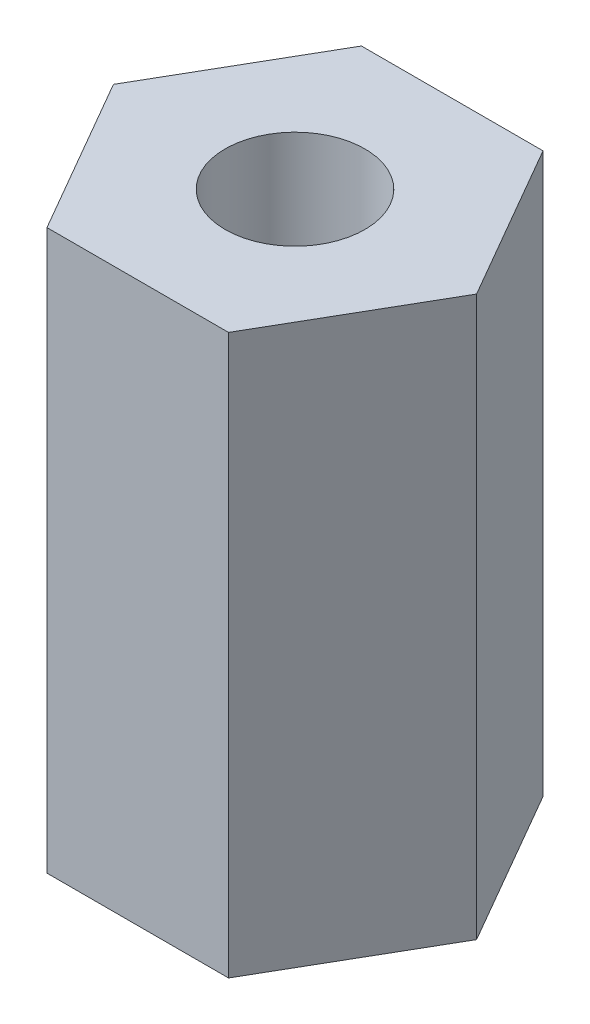
ISO-10303-21;
HEADER;
FILE_DESCRIPTION(('STEP AP214'),'2;1');
FILE_NAME('part.step','',(''),(''),'','','');
FILE_SCHEMA(('AUTOMOTIVE_DESIGN { 1 0 10303 214 1 1 1 1 }'));
ENDSEC;
DATA;
#1=APPLICATION_CONTEXT('core data for automotive mechanical design processes');
#2=APPLICATION_PROTOCOL_DEFINITION('international standard','automotive_design',2000,#1);
#3=PRODUCT_CONTEXT('',#1,'mechanical');
#4=PRODUCT('Part','Part','',(#3));
#5=PRODUCT_RELATED_PRODUCT_CATEGORY('part','',(#4));
#6=PRODUCT_DEFINITION_FORMATION('','',#4);
#7=PRODUCT_DEFINITION_CONTEXT('part definition',#1,'design');
#8=PRODUCT_DEFINITION('design','',#6,#7);
#9=PRODUCT_DEFINITION_SHAPE('','',#8);
#10=(LENGTH_UNIT() NAMED_UNIT(*) SI_UNIT(.MILLI.,.METRE.));
#11=(NAMED_UNIT(*) PLANE_ANGLE_UNIT() SI_UNIT($,.RADIAN.));
#12=(NAMED_UNIT(*) SI_UNIT($,.STERADIAN.) SOLID_ANGLE_UNIT());
#13=UNCERTAINTY_MEASURE_WITH_UNIT(LENGTH_MEASURE(1.E-05),#10,'distance_accuracy_value','');
#14=(GEOMETRIC_REPRESENTATION_CONTEXT(3) GLOBAL_UNCERTAINTY_ASSIGNED_CONTEXT((#13)) GLOBAL_UNIT_ASSIGNED_CONTEXT((#10,
#11,#12)) REPRESENTATION_CONTEXT('',''));
#15=CARTESIAN_POINT('',(0.,0.,0.));
#16=DIRECTION('',(0.,0.,1.));
#17=DIRECTION('',(1.,0.,0.));
#18=AXIS2_PLACEMENT_3D('',#15,#16,#17);
#19=CARTESIAN_POINT('',(0.,5.08,0.));
#20=DIRECTION('',(0.,1.,0.));
#21=DIRECTION('',(0.,0.,1.));
#22=AXIS2_PLACEMENT_3D('',#19,#20,#21);
#23=PLANE('',#22);
#24=DIRECTION('',(1.,0.,0.));
#25=VECTOR('',#24,1.);
#26=CARTESIAN_POINT('',(-1.64977839420936,5.08,2.8575));
#27=LINE('',#26,#25);
#28=CARTESIAN_POINT('',(-1.64977839420936,5.08,2.8575));
#29=VERTEX_POINT('',#28);
#30=CARTESIAN_POINT('',(1.64977839420935,5.08,2.8575));
#31=VERTEX_POINT('',#30);
#32=EDGE_CURVE('E130',#29,#31,#27,.T.);
#33=ORIENTED_EDGE('',*,*,#32,.T.);
#34=DIRECTION('',(0.5,0.,-0.866025403784439));
#35=VECTOR('',#34,1.);
#36=CARTESIAN_POINT('',(1.64977839420935,5.08,2.8575));
#37=LINE('',#36,#35);
#38=CARTESIAN_POINT('',(3.29955678841871,5.08,0.));
#39=VERTEX_POINT('',#38);
#40=EDGE_CURVE('E88',#31,#39,#37,.T.);
#41=ORIENTED_EDGE('',*,*,#40,.T.);
#42=DIRECTION('',(-0.5,0.,-0.866025403784438));
#43=VECTOR('',#42,1.);
#44=CARTESIAN_POINT('',(3.29955678841871,5.08,0.));
#45=LINE('',#44,#43);
#46=CARTESIAN_POINT('',(1.64977839420935,5.08,-2.8575));
#47=VERTEX_POINT('',#46);
#48=EDGE_CURVE('E101',#39,#47,#45,.T.);
#49=ORIENTED_EDGE('',*,*,#48,.T.);
#50=DIRECTION('',(-1.,0.,0.));
#51=VECTOR('',#50,1.);
#52=CARTESIAN_POINT('',(1.64977839420935,5.08,-2.8575));
#53=LINE('',#52,#51);
#54=CARTESIAN_POINT('',(-1.64977839420936,5.08,-2.8575));
#55=VERTEX_POINT('',#54);
#56=EDGE_CURVE('E95',#47,#55,#53,.T.);
#57=ORIENTED_EDGE('',*,*,#56,.T.);
#58=DIRECTION('',(-0.5,0.,0.866025403784438));
#59=VECTOR('',#58,1.);
#60=CARTESIAN_POINT('',(-1.64977839420936,5.08,-2.8575));
#61=LINE('',#60,#59);
#62=CARTESIAN_POINT('',(-3.29955678841871,5.08,0.));
#63=VERTEX_POINT('',#62);
#64=EDGE_CURVE('E99',#55,#63,#61,.T.);
#65=ORIENTED_EDGE('',*,*,#64,.T.);
#66=DIRECTION('',(0.5,0.,0.866025403784438));
#67=VECTOR('',#66,1.);
#68=CARTESIAN_POINT('',(-3.29955678841871,5.08,0.));
#69=LINE('',#68,#67);
#70=EDGE_CURVE('E51',#63,#29,#69,.T.);
#71=ORIENTED_EDGE('',*,*,#70,.T.);
#72=EDGE_LOOP('',(#33,#41,#49,#57,#65,#71));
#73=FACE_BOUND('',#72,.T.);
#74=CARTESIAN_POINT('',(0.,5.08,0.));
#75=DIRECTION('',(0.,1.,0.));
#76=DIRECTION('',(0.,0.,1.));
#77=AXIS2_PLACEMENT_3D('',#74,#75,#76);
#78=CIRCLE('',#77,1.27);
#79=CARTESIAN_POINT('',(0.,5.08,1.27));
#80=VERTEX_POINT('',#79);
#81=EDGE_CURVE('E123',#80,#80,#78,.T.);
#82=ORIENTED_EDGE('',*,*,#81,.F.);
#83=EDGE_LOOP('',(#82));
#84=FACE_BOUND('',#83,.T.);
#85=ADVANCED_FACE('F34',(#73,#84),#23,.T.);
#86=CARTESIAN_POINT('',(0.,-5.08,0.));
#87=DIRECTION('',(0.,1.,0.));
#88=DIRECTION('',(0.,0.,1.));
#89=AXIS2_PLACEMENT_3D('',#86,#87,#88);
#90=PLANE('',#89);
#91=DIRECTION('',(1.,0.,0.));
#92=VECTOR('',#91,1.);
#93=CARTESIAN_POINT('',(-1.64977839420936,-5.08,2.8575));
#94=LINE('',#93,#92);
#95=CARTESIAN_POINT('',(-1.64977839420936,-5.08,2.8575));
#96=VERTEX_POINT('',#95);
#97=CARTESIAN_POINT('',(1.64977839420935,-5.08,2.8575));
#98=VERTEX_POINT('',#97);
#99=EDGE_CURVE('E119',#96,#98,#94,.T.);
#100=ORIENTED_EDGE('',*,*,#99,.F.);
#101=DIRECTION('',(0.5,0.,0.866025403784438));
#102=VECTOR('',#101,1.);
#103=CARTESIAN_POINT('',(-3.29955678841871,-5.08,0.));
#104=LINE('',#103,#102);
#105=CARTESIAN_POINT('',(-3.29955678841871,-5.08,0.));
#106=VERTEX_POINT('',#105);
#107=EDGE_CURVE('E80',#106,#96,#104,.T.);
#108=ORIENTED_EDGE('',*,*,#107,.F.);
#109=DIRECTION('',(-0.5,0.,0.866025403784438));
#110=VECTOR('',#109,1.);
#111=CARTESIAN_POINT('',(-1.64977839420936,-5.08,-2.8575));
#112=LINE('',#111,#110);
#113=CARTESIAN_POINT('',(-1.64977839420936,-5.08,-2.8575));
#114=VERTEX_POINT('',#113);
#115=EDGE_CURVE('E74',#114,#106,#112,.T.);
#116=ORIENTED_EDGE('',*,*,#115,.F.);
#117=DIRECTION('',(-1.,0.,0.));
#118=VECTOR('',#117,1.);
#119=CARTESIAN_POINT('',(1.64977839420935,-5.08,-2.8575));
#120=LINE('',#119,#118);
#121=CARTESIAN_POINT('',(1.64977839420935,-5.08,-2.8575));
#122=VERTEX_POINT('',#121);
#123=EDGE_CURVE('E109',#122,#114,#120,.T.);
#124=ORIENTED_EDGE('',*,*,#123,.F.);
#125=DIRECTION('',(-0.5,0.,-0.866025403784438));
#126=VECTOR('',#125,1.);
#127=CARTESIAN_POINT('',(3.29955678841871,-5.08,0.));
#128=LINE('',#127,#126);
#129=CARTESIAN_POINT('',(3.29955678841871,-5.08,0.));
#130=VERTEX_POINT('',#129);
#131=EDGE_CURVE('E125',#130,#122,#128,.T.);
#132=ORIENTED_EDGE('',*,*,#131,.F.);
#133=DIRECTION('',(0.5,0.,-0.866025403784439));
#134=VECTOR('',#133,1.);
#135=CARTESIAN_POINT('',(1.64977839420935,-5.08,2.8575));
#136=LINE('',#135,#134);
#137=EDGE_CURVE('E122',#98,#130,#136,.T.);
#138=ORIENTED_EDGE('',*,*,#137,.F.);
#139=EDGE_LOOP('',(#100,#108,#116,#124,#132,#138));
#140=FACE_BOUND('',#139,.T.);
#141=CARTESIAN_POINT('',(0.,-5.08,0.));
#142=DIRECTION('',(0.,1.,0.));
#143=DIRECTION('',(0.,0.,1.));
#144=AXIS2_PLACEMENT_3D('',#141,#142,#143);
#145=CIRCLE('',#144,1.27);
#146=CARTESIAN_POINT('',(0.,-5.08,1.27));
#147=VERTEX_POINT('',#146);
#148=EDGE_CURVE('E223',#147,#147,#145,.T.);
#149=ORIENTED_EDGE('',*,*,#148,.T.);
#150=EDGE_LOOP('',(#149));
#151=FACE_BOUND('',#150,.T.);
#152=ADVANCED_FACE('F139',(#140,#151),#90,.F.);
#153=CARTESIAN_POINT('',(-1.64977839420936,5.08,2.8575));
#154=DIRECTION('',(0.,0.,-1.));
#155=DIRECTION('',(-1.,0.,0.));
#156=AXIS2_PLACEMENT_3D('',#153,#154,#155);
#157=PLANE('',#156);
#158=ORIENTED_EDGE('',*,*,#99,.T.);
#159=DIRECTION('',(0.,-1.,0.));
#160=VECTOR('',#159,1.);
#161=CARTESIAN_POINT('',(1.64977839420935,5.08,2.8575));
#162=LINE('',#161,#160);
#163=EDGE_CURVE('E11',#31,#98,#162,.T.);
#164=ORIENTED_EDGE('',*,*,#163,.F.);
#165=ORIENTED_EDGE('',*,*,#32,.F.);
#166=DIRECTION('',(0.,-1.,0.));
#167=VECTOR('',#166,1.);
#168=CARTESIAN_POINT('',(-1.64977839420936,5.08,2.8575));
#169=LINE('',#168,#167);
#170=EDGE_CURVE('E115',#29,#96,#169,.T.);
#171=ORIENTED_EDGE('',*,*,#170,.T.);
#172=EDGE_LOOP('',(#158,#164,#165,#171));
#173=FACE_BOUND('',#172,.T.);
#174=ADVANCED_FACE('F36',(#173),#157,.F.);
#175=CARTESIAN_POINT('',(1.64977839420935,5.08,2.8575));
#176=DIRECTION('',(-0.866025403784439,0.,-0.5));
#177=DIRECTION('',(-0.5,0.,0.866025403784439));
#178=AXIS2_PLACEMENT_3D('',#175,#176,#177);
#179=PLANE('',#178);
#180=ORIENTED_EDGE('',*,*,#137,.T.);
#181=DIRECTION('',(0.,-1.,0.));
#182=VECTOR('',#181,1.);
#183=CARTESIAN_POINT('',(3.29955678841871,5.08,0.));
#184=LINE('',#183,#182);
#185=EDGE_CURVE('E43',#39,#130,#184,.T.);
#186=ORIENTED_EDGE('',*,*,#185,.F.);
#187=ORIENTED_EDGE('',*,*,#40,.F.);
#188=ORIENTED_EDGE('',*,*,#163,.T.);
#189=EDGE_LOOP('',(#180,#186,#187,#188));
#190=FACE_BOUND('',#189,.T.);
#191=ADVANCED_FACE('F164',(#190),#179,.F.);
#192=CARTESIAN_POINT('',(3.29955678841871,5.08,0.));
#193=DIRECTION('',(-0.866025403784438,0.,0.5));
#194=DIRECTION('',(0.5,0.,0.866025403784438));
#195=AXIS2_PLACEMENT_3D('',#192,#193,#194);
#196=PLANE('',#195);
#197=ORIENTED_EDGE('',*,*,#131,.T.);
#198=DIRECTION('',(0.,-1.,0.));
#199=VECTOR('',#198,1.);
#200=CARTESIAN_POINT('',(1.64977839420935,5.08,-2.8575));
#201=LINE('',#200,#199);
#202=EDGE_CURVE('E110',#47,#122,#201,.T.);
#203=ORIENTED_EDGE('',*,*,#202,.F.);
#204=ORIENTED_EDGE('',*,*,#48,.F.);
#205=ORIENTED_EDGE('',*,*,#185,.T.);
#206=EDGE_LOOP('',(#197,#203,#204,#205));
#207=FACE_BOUND('',#206,.T.);
#208=ADVANCED_FACE('F136',(#207),#196,.F.);
#209=CARTESIAN_POINT('',(1.64977839420935,5.08,-2.8575));
#210=DIRECTION('',(0.,0.,1.));
#211=DIRECTION('',(1.,0.,0.));
#212=AXIS2_PLACEMENT_3D('',#209,#210,#211);
#213=PLANE('',#212);
#214=ORIENTED_EDGE('',*,*,#123,.T.);
#215=DIRECTION('',(0.,-1.,0.));
#216=VECTOR('',#215,1.);
#217=CARTESIAN_POINT('',(-1.64977839420936,5.08,-2.8575));
#218=LINE('',#217,#216);
#219=EDGE_CURVE('E106',#55,#114,#218,.T.);
#220=ORIENTED_EDGE('',*,*,#219,.F.);
#221=ORIENTED_EDGE('',*,*,#56,.F.);
#222=ORIENTED_EDGE('',*,*,#202,.T.);
#223=EDGE_LOOP('',(#214,#220,#221,#222));
#224=FACE_BOUND('',#223,.T.);
#225=ADVANCED_FACE('F107',(#224),#213,.F.);
#226=CARTESIAN_POINT('',(-1.64977839420936,5.08,-2.8575));
#227=DIRECTION('',(0.866025403784438,0.,0.5));
#228=DIRECTION('',(0.5,0.,-0.866025403784439));
#229=AXIS2_PLACEMENT_3D('',#226,#227,#228);
#230=PLANE('',#229);
#231=ORIENTED_EDGE('',*,*,#115,.T.);
#232=DIRECTION('',(0.,-1.,0.));
#233=VECTOR('',#232,1.);
#234=CARTESIAN_POINT('',(-3.29955678841871,5.08,0.));
#235=LINE('',#234,#233);
#236=EDGE_CURVE('E111',#63,#106,#235,.T.);
#237=ORIENTED_EDGE('',*,*,#236,.F.);
#238=ORIENTED_EDGE('',*,*,#64,.F.);
#239=ORIENTED_EDGE('',*,*,#219,.T.);
#240=EDGE_LOOP('',(#231,#237,#238,#239));
#241=FACE_BOUND('',#240,.T.);
#242=ADVANCED_FACE('F113',(#241),#230,.F.);
#243=CARTESIAN_POINT('',(-3.29955678841871,5.08,0.));
#244=DIRECTION('',(0.866025403784438,0.,-0.5));
#245=DIRECTION('',(-0.5,0.,-0.866025403784438));
#246=AXIS2_PLACEMENT_3D('',#243,#244,#245);
#247=PLANE('',#246);
#248=ORIENTED_EDGE('',*,*,#107,.T.);
#249=ORIENTED_EDGE('',*,*,#170,.F.);
#250=ORIENTED_EDGE('',*,*,#70,.F.);
#251=ORIENTED_EDGE('',*,*,#236,.T.);
#252=EDGE_LOOP('',(#248,#249,#250,#251));
#253=FACE_BOUND('',#252,.T.);
#254=ADVANCED_FACE('F144',(#253),#247,.F.);
#255=CARTESIAN_POINT('',(0.,5.08,0.));
#256=DIRECTION('',(0.,-1.,0.));
#257=DIRECTION('',(0.,0.,-1.));
#258=AXIS2_PLACEMENT_3D('',#255,#256,#257);
#259=CYLINDRICAL_SURFACE('',#258,1.27);
#260=ORIENTED_EDGE('',*,*,#81,.T.);
#261=EDGE_LOOP('',(#260));
#262=FACE_BOUND('',#261,.T.);
#263=ORIENTED_EDGE('',*,*,#148,.F.);
#264=EDGE_LOOP('',(#263));
#265=FACE_BOUND('',#264,.T.);
#266=ADVANCED_FACE('F146',(#262,#265),#259,.F.);
#267=CLOSED_SHELL('',(#85,#152,#174,#191,#208,#225,#242,#254,#266));
#268=MANIFOLD_SOLID_BREP('B2',#267);
#269=ADVANCED_BREP_SHAPE_REPRESENTATION('',(#18,#268),#14);
#270=SHAPE_DEFINITION_REPRESENTATION(#9,#269);
ENDSEC;
END-ISO-10303-21;
